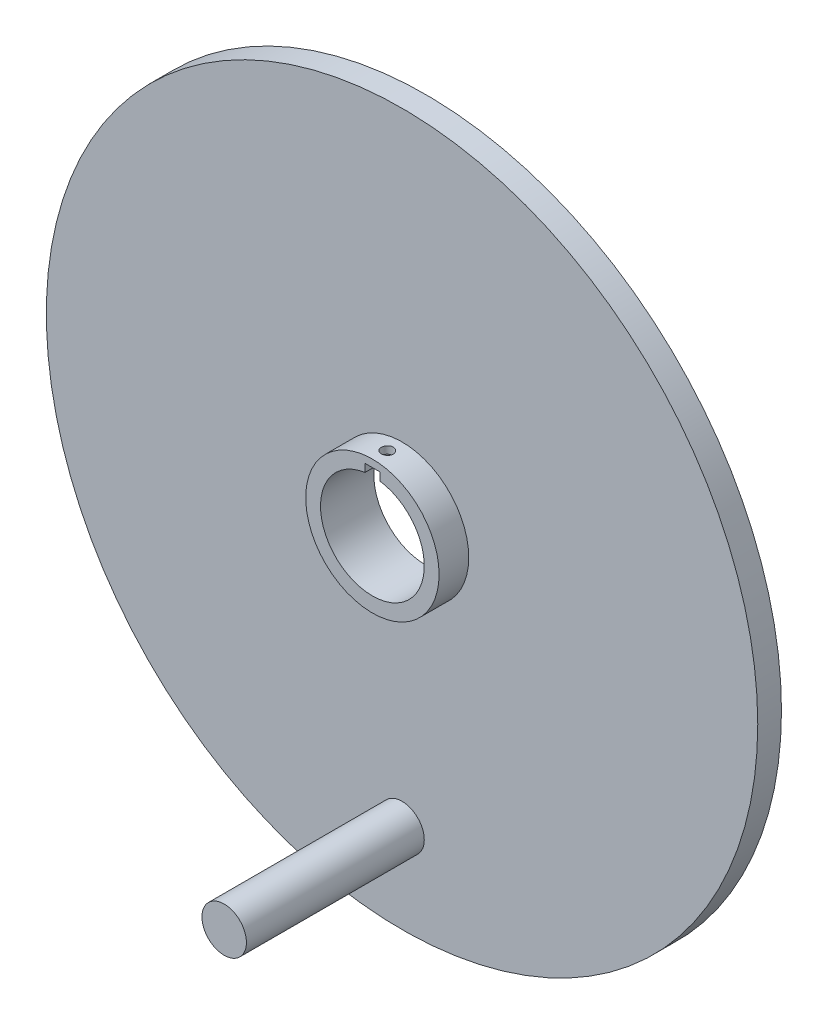
ISO-10303-21;
HEADER;
FILE_DESCRIPTION(('STEP AP214'),'2;1');
FILE_NAME('part.step','',(''),(''),'','','');
FILE_SCHEMA(('AUTOMOTIVE_DESIGN { 1 0 10303 214 1 1 1 1 }'));
ENDSEC;
DATA;
#1=APPLICATION_CONTEXT('core data for automotive mechanical design processes');
#2=APPLICATION_PROTOCOL_DEFINITION('international standard','automotive_design',2000,#1);
#3=PRODUCT_CONTEXT('',#1,'mechanical');
#4=PRODUCT('Part','Part','',(#3));
#5=PRODUCT_RELATED_PRODUCT_CATEGORY('part','',(#4));
#6=PRODUCT_DEFINITION_FORMATION('','',#4);
#7=PRODUCT_DEFINITION_CONTEXT('part definition',#1,'design');
#8=PRODUCT_DEFINITION('design','',#6,#7);
#9=PRODUCT_DEFINITION_SHAPE('','',#8);
#10=(LENGTH_UNIT() NAMED_UNIT(*) SI_UNIT(.MILLI.,.METRE.));
#11=(NAMED_UNIT(*) PLANE_ANGLE_UNIT() SI_UNIT($,.RADIAN.));
#12=(NAMED_UNIT(*) SI_UNIT($,.STERADIAN.) SOLID_ANGLE_UNIT());
#13=UNCERTAINTY_MEASURE_WITH_UNIT(LENGTH_MEASURE(1.E-05),#10,'distance_accuracy_value','');
#14=(GEOMETRIC_REPRESENTATION_CONTEXT(3) GLOBAL_UNCERTAINTY_ASSIGNED_CONTEXT((#13)) GLOBAL_UNIT_ASSIGNED_CONTEXT((#10,
#11,#12)) REPRESENTATION_CONTEXT('',''));
#15=CARTESIAN_POINT('',(0.,0.,0.));
#16=DIRECTION('',(0.,0.,1.));
#17=DIRECTION('',(1.,0.,0.));
#18=AXIS2_PLACEMENT_3D('',#15,#16,#17);
#19=CARTESIAN_POINT('',(0.,0.,18.));
#20=DIRECTION('',(0.,0.,-1.));
#21=DIRECTION('',(-1.,0.,0.));
#22=AXIS2_PLACEMENT_3D('',#19,#20,#21);
#23=CYLINDRICAL_SURFACE('',#22,22.5);
#24=CARTESIAN_POINT('',(0.,0.,18.));
#25=DIRECTION('',(0.,0.,1.));
#26=DIRECTION('',(1.,0.,0.));
#27=AXIS2_PLACEMENT_3D('',#24,#25,#26);
#28=CIRCLE('',#27,22.5);
#29=CARTESIAN_POINT('',(22.5,0.,18.));
#30=VERTEX_POINT('',#29);
#31=EDGE_CURVE('E109',#30,#30,#28,.T.);
#32=ORIENTED_EDGE('',*,*,#31,.F.);
#33=EDGE_LOOP('',(#32));
#34=FACE_BOUND('',#33,.T.);
#35=CARTESIAN_POINT('',(0.,0.,8.));
#36=DIRECTION('',(0.,0.,1.));
#37=DIRECTION('',(1.,0.,0.));
#38=AXIS2_PLACEMENT_3D('',#35,#36,#37);
#39=CIRCLE('',#38,22.5);
#40=CARTESIAN_POINT('',(22.5,0.,8.));
#41=VERTEX_POINT('',#40);
#42=EDGE_CURVE('E108',#41,#41,#39,.T.);
#43=ORIENTED_EDGE('',*,*,#42,.T.);
#44=EDGE_LOOP('',(#43));
#45=FACE_BOUND('',#44,.T.);
#46=CARTESIAN_POINT('',(0.,22.5,11.));
#47=CARTESIAN_POINT('',(-0.112103513817553,22.499998841049,11.0000048838877));
#48=CARTESIAN_POINT('',(-0.224282655152045,22.4991532643947,11.0094571119053));
#49=CARTESIAN_POINT('',(-0.445535202780816,22.4958613940795,11.0470236371428));
#50=CARTESIAN_POINT('',(-0.554604977181987,22.4934133026036,11.0751588948258));
#51=CARTESIAN_POINT('',(-0.766402486160084,22.4871929547959,11.1492697190377));
#52=CARTESIAN_POINT('',(-0.869133845484064,22.4834214636859,11.1952349774461));
#53=CARTESIAN_POINT('',(-1.06539921818257,22.4749768821186,11.3036820722199));
#54=CARTESIAN_POINT('',(-1.15893514981746,22.47030398031,11.3661604537051));
#55=CARTESIAN_POINT('',(-1.33444762738098,22.4605656133862,11.5060540030495));
#56=CARTESIAN_POINT('',(-1.41639403453921,22.4554991759624,11.5835069191725));
#57=CARTESIAN_POINT('',(-1.56614255656144,22.4455528773909,11.7510708848522));
#58=CARTESIAN_POINT('',(-1.63394404001184,22.4406730245801,11.8411824991788));
#59=CARTESIAN_POINT('',(-1.75358177510593,22.4316421475586,12.031690592255));
#60=CARTESIAN_POINT('',(-1.80539126224074,22.4274923501196,12.1321039420635));
#61=CARTESIAN_POINT('',(-1.89140338443427,22.4204029110342,12.3402477540592));
#62=CARTESIAN_POINT('',(-1.92560636914368,22.4174632453557,12.4479780708894));
#63=CARTESIAN_POINT('',(-1.97534648409909,22.4131353097158,12.6673938000392));
#64=CARTESIAN_POINT('',(-1.9909330386816,22.4117429325812,12.7790679258317));
#65=CARTESIAN_POINT('',(-2.00315056442579,22.4106543281064,13.003455244577));
#66=CARTESIAN_POINT('',(-1.9997819358826,22.4109580649477,13.1161684155371));
#67=CARTESIAN_POINT('',(-1.97422552957043,22.413223630757,13.3390949859568));
#68=CARTESIAN_POINT('',(-1.95209154398904,22.4151807202191,13.4493146070888));
#69=CARTESIAN_POINT('',(-1.88971633801144,22.4205250533742,13.6644682253377));
#70=CARTESIAN_POINT('',(-1.84947491944523,22.4239123127191,13.7694021645936));
#71=CARTESIAN_POINT('',(-1.75196719256288,22.4317407834582,13.9711766873128));
#72=CARTESIAN_POINT('',(-1.6946768342642,22.4361834819036,14.0680055885631));
#73=CARTESIAN_POINT('',(-1.56471480998869,22.4456209172064,14.2506936393237));
#74=CARTESIAN_POINT('',(-1.49204278900312,22.450615666804,14.3365525355731));
#75=CARTESIAN_POINT('',(-1.33307902145923,22.4606155201411,14.4951760717322));
#76=CARTESIAN_POINT('',(-1.24674078579769,22.4656205994758,14.567894132508));
#77=CARTESIAN_POINT('',(-1.06305736369639,22.4750606649908,14.6978113821694));
#78=CARTESIAN_POINT('',(-0.965712168498791,22.4794956507175,14.755010558707));
#79=CARTESIAN_POINT('',(-0.762747198146112,22.4872968545856,14.8522637887687));
#80=CARTESIAN_POINT('',(-0.657126383933074,22.4906629382503,14.8923156852459));
#81=CARTESIAN_POINT('',(-0.440622671897876,22.4959455915378,14.9541043399795));
#82=CARTESIAN_POINT('',(-0.329739898412671,22.4978621953927,14.9758415307741));
#83=CARTESIAN_POINT('',(-0.106263448462925,22.5000255466339,15.0003251189865));
#84=CARTESIAN_POINT('',(0.00632312900749421,22.5002779494562,15.0031358347306));
#85=CARTESIAN_POINT('',(0.230365844637086,22.4990995832364,14.9898553159933));
#86=CARTESIAN_POINT('',(0.341821994804208,22.4976688320926,14.9737642825081));
#87=CARTESIAN_POINT('',(0.560255927280843,22.4932886530511,14.9231903559356));
#88=CARTESIAN_POINT('',(0.667240687757264,22.4903416949801,14.8887373703027));
#89=CARTESIAN_POINT('',(0.873911328849083,22.48326001163,14.8024481386809));
#90=CARTESIAN_POINT('',(0.973597078729127,22.4791252650825,14.7506115814211));
#91=CARTESIAN_POINT('',(1.16313209411638,22.4701170931205,14.6308656891189));
#92=CARTESIAN_POINT('',(1.25295441515761,22.4652417269551,14.5629138543877));
#93=CARTESIAN_POINT('',(1.41994062176185,22.4553062675826,14.4129275596715));
#94=CARTESIAN_POINT('',(1.49710425692056,22.4502461707237,14.3308928211751));
#95=CARTESIAN_POINT('',(1.63680416955372,22.4404947242168,14.1547897959009));
#96=CARTESIAN_POINT('',(1.69929839944319,22.4358044595506,14.0606880849501));
#97=CARTESIAN_POINT('',(1.80759698106831,22.4273394873951,13.8632882117221));
#98=CARTESIAN_POINT('',(1.85340151900228,22.4235647696917,13.75999015206));
#99=CARTESIAN_POINT('',(1.92694925420648,22.4173646141511,13.5472772489183));
#100=CARTESIAN_POINT('',(1.95471796462342,22.414937271053,13.4378712846924));
#101=CARTESIAN_POINT('',(1.9914887720945,22.4117004838982,13.215927148397));
#102=CARTESIAN_POINT('',(2.00049128492813,22.4108910039965,13.1033890457784));
#103=CARTESIAN_POINT('',(1.99946904895077,22.4109821979608,12.8787930507751));
#104=CARTESIAN_POINT('',(1.98951036026824,22.4118769344038,12.7667348494104));
#105=CARTESIAN_POINT('',(1.95098639898583,22.4152631183473,12.5458894961554));
#106=CARTESIAN_POINT('',(1.92242110011842,22.417754568102,12.4371023488832));
#107=CARTESIAN_POINT('',(1.84751200227508,22.4240518674675,12.2258844112851));
#108=CARTESIAN_POINT('',(1.80116963693464,22.4278576110845,12.1234531091643));
#109=CARTESIAN_POINT('',(1.69202906668557,22.4363548843694,11.9278132463832));
#110=CARTESIAN_POINT('',(1.62923106773845,22.4410464029507,11.834604570311));
#111=CARTESIAN_POINT('',(1.48871346789508,22.4508061076651,11.6597174745051));
#112=CARTESIAN_POINT('',(1.41094481754435,22.455875497432,11.578078531764));
#113=CARTESIAN_POINT('',(1.24278571224902,22.4658087348866,11.4289773867176));
#114=CARTESIAN_POINT('',(1.15239221773902,22.4706725327074,11.3615186082648));
#115=CARTESIAN_POINT('',(0.961352108627444,22.479656553239,11.242589020496));
#116=CARTESIAN_POINT('',(0.860684717484236,22.4837752205534,11.1911514963903));
#117=CARTESIAN_POINT('',(0.652172657916491,22.4907871749524,11.1059762928281));
#118=CARTESIAN_POINT('',(0.544336350087787,22.4936818614435,11.0722183892421));
#119=CARTESIAN_POINT('',(0.363226469823293,22.4971815146108,11.0319019955605));
#120=CARTESIAN_POINT('',(0.291115543292061,22.4982335985338,11.0199547865985));
#121=CARTESIAN_POINT('',(0.146013772450278,22.4996432176176,11.0040022104501));
#122=CARTESIAN_POINT('',(0.0730229308628294,22.5000007549273,10.9999968186921));
#123=CARTESIAN_POINT('',(0.,22.5,11.));
#124=B_SPLINE_CURVE_WITH_KNOTS('',3,(#46,#47,#48,#49,#50,#51,#52,#53,#54,#55,#56,#57,#58,#59,
#60,#61,#62,#63,#64,#65,#66,#67,#68,#69,#70,#71,#72,#73,#74,#75,#76,#77,#78,#79,#80,#81,#82,#83,
#84,#85,#86,#87,#88,#89,#90,#91,#92,#93,#94,#95,#96,#97,#98,#99,#100,#101,#102,#103,#104,#105,
#106,#107,#108,#109,#110,#111,#112,#113,#114,#115,#116,#117,#118,#119,#120,#121,#122,#123),
.UNSPECIFIED.,.T.,.F.,(4,2,2,2,2,2,2,2,2,2,2,2,2,2,2,2,2,2,2,2,2,2,2,2,2,2,2,2,2,2,2,2,2,2,2,2,
2,2,4),(0.,0.336043915895959,0.672465477350701,1.00869283142059,1.34484989551893,
1.68186567154393,2.01889648835958,2.35648834568506,2.69407349845462,3.03076039765135,
3.36744018672833,3.70315811056492,4.03887970862984,4.37507715351966,4.71128235869214,
5.04865685412811,5.38603161800295,5.72344880957018,6.06085803213697,6.39712004703985,
6.73337848625503,7.06909090308952,7.40480933152664,7.74142316985629,8.07804366601699,
8.41561756166208,8.75318769105355,9.09027925394884,9.42736334824279,9.76327520249732,
10.0991875309702,10.4350727754115,10.7709538160566,11.1079546578805,11.4450367765554,
11.7828146049765,12.1202051928234,12.3391009858617,12.5579961016498),.UNSPECIFIED.);
#125=CARTESIAN_POINT('',(0.,22.5,11.));
#126=VERTEX_POINT('',#125);
#127=EDGE_CURVE('E36',#126,#126,#124,.T.);
#128=ORIENTED_EDGE('',*,*,#127,.F.);
#129=EDGE_LOOP('',(#128));
#130=FACE_BOUND('',#129,.T.);
#131=ADVANCED_FACE('F32',(#34,#45,#130),#23,.T.);
#132=CARTESIAN_POINT('',(0.,0.,8.));
#133=DIRECTION('',(0.,0.,1.));
#134=DIRECTION('',(1.,0.,0.));
#135=AXIS2_PLACEMENT_3D('',#132,#133,#134);
#136=PLANE('',#135);
#137=CARTESIAN_POINT('',(0.,-90.,8.));
#138=DIRECTION('',(0.,0.,1.));
#139=DIRECTION('',(1.,0.,0.));
#140=AXIS2_PLACEMENT_3D('',#137,#138,#139);
#141=CIRCLE('',#140,7.5);
#142=CARTESIAN_POINT('',(7.50000000000001,-90.,8.));
#143=VERTEX_POINT('',#142);
#144=EDGE_CURVE('E175',#143,#143,#141,.T.);
#145=ORIENTED_EDGE('',*,*,#144,.F.);
#146=EDGE_LOOP('',(#145));
#147=FACE_BOUND('',#146,.T.);
#148=CARTESIAN_POINT('',(0.,0.,8.));
#149=DIRECTION('',(0.,0.,1.));
#150=DIRECTION('',(1.,0.,0.));
#151=AXIS2_PLACEMENT_3D('',#148,#149,#150);
#152=CIRCLE('',#151,120.);
#153=CARTESIAN_POINT('',(120.,0.,8.));
#154=VERTEX_POINT('',#153);
#155=EDGE_CURVE('E11',#154,#154,#152,.T.);
#156=ORIENTED_EDGE('',*,*,#155,.T.);
#157=EDGE_LOOP('',(#156));
#158=FACE_BOUND('',#157,.T.);
#159=ORIENTED_EDGE('',*,*,#42,.F.);
#160=EDGE_LOOP('',(#159));
#161=FACE_BOUND('',#160,.T.);
#162=ADVANCED_FACE('F131',(#147,#158,#161),#136,.T.);
#163=CARTESIAN_POINT('',(0.,0.,0.));
#164=DIRECTION('',(0.,0.,1.));
#165=DIRECTION('',(1.,0.,0.));
#166=AXIS2_PLACEMENT_3D('',#163,#164,#165);
#167=PLANE('',#166);
#168=CARTESIAN_POINT('',(0.,0.,0.));
#169=DIRECTION('',(0.,0.,1.));
#170=DIRECTION('',(1.,0.,0.));
#171=AXIS2_PLACEMENT_3D('',#168,#169,#170);
#172=CIRCLE('',#171,120.);
#173=CARTESIAN_POINT('',(120.,0.,0.));
#174=VERTEX_POINT('',#173);
#175=EDGE_CURVE('E46',#174,#174,#172,.T.);
#176=ORIENTED_EDGE('',*,*,#175,.F.);
#177=EDGE_LOOP('',(#176));
#178=FACE_BOUND('',#177,.T.);
#179=CARTESIAN_POINT('',(0.,0.,0.));
#180=DIRECTION('',(0.,0.,1.));
#181=DIRECTION('',(1.,0.,0.));
#182=AXIS2_PLACEMENT_3D('',#179,#180,#181);
#183=CIRCLE('',#182,17.5);
#184=CARTESIAN_POINT('',(-2.5,17.3205080756888,0.));
#185=VERTEX_POINT('',#184);
#186=CARTESIAN_POINT('',(2.5,17.3205080756888,0.));
#187=VERTEX_POINT('',#186);
#188=EDGE_CURVE('E54',#185,#187,#183,.T.);
#189=ORIENTED_EDGE('',*,*,#188,.T.);
#190=DIRECTION('',(0.,1.,0.));
#191=VECTOR('',#190,1.);
#192=CARTESIAN_POINT('',(2.5,20.,0.));
#193=LINE('',#192,#191);
#194=CARTESIAN_POINT('',(2.5,20.,0.));
#195=VERTEX_POINT('',#194);
#196=EDGE_CURVE('E88',#187,#195,#193,.T.);
#197=ORIENTED_EDGE('',*,*,#196,.T.);
#198=DIRECTION('',(-1.,0.,0.));
#199=VECTOR('',#198,1.);
#200=CARTESIAN_POINT('',(-2.5,20.,0.));
#201=LINE('',#200,#199);
#202=CARTESIAN_POINT('',(-2.5,20.,0.));
#203=VERTEX_POINT('',#202);
#204=EDGE_CURVE('E116',#195,#203,#201,.T.);
#205=ORIENTED_EDGE('',*,*,#204,.T.);
#206=DIRECTION('',(0.,-1.,0.));
#207=VECTOR('',#206,1.);
#208=CARTESIAN_POINT('',(-2.5,20.,0.));
#209=LINE('',#208,#207);
#210=EDGE_CURVE('E119',#203,#185,#209,.T.);
#211=ORIENTED_EDGE('',*,*,#210,.T.);
#212=EDGE_LOOP('',(#189,#197,#205,#211));
#213=FACE_BOUND('',#212,.T.);
#214=ADVANCED_FACE('F128',(#178,#213),#167,.F.);
#215=CARTESIAN_POINT('',(0.,0.,8.));
#216=DIRECTION('',(0.,0.,-1.));
#217=DIRECTION('',(-1.,0.,0.));
#218=AXIS2_PLACEMENT_3D('',#215,#216,#217);
#219=CYLINDRICAL_SURFACE('',#218,120.);
#220=ORIENTED_EDGE('',*,*,#155,.F.);
#221=EDGE_LOOP('',(#220));
#222=FACE_BOUND('',#221,.T.);
#223=ORIENTED_EDGE('',*,*,#175,.T.);
#224=EDGE_LOOP('',(#223));
#225=FACE_BOUND('',#224,.T.);
#226=ADVANCED_FACE('F34',(#222,#225),#219,.T.);
#227=CARTESIAN_POINT('',(0.,0.,8.));
#228=DIRECTION('',(0.,0.,-1.));
#229=DIRECTION('',(-1.,0.,0.));
#230=AXIS2_PLACEMENT_3D('',#227,#228,#229);
#231=CYLINDRICAL_SURFACE('',#230,17.5);
#232=ORIENTED_EDGE('',*,*,#188,.F.);
#233=DIRECTION('',(0.,0.,-1.));
#234=VECTOR('',#233,1.);
#235=CARTESIAN_POINT('',(-2.5,17.3205080756888,8.));
#236=LINE('',#235,#234);
#237=CARTESIAN_POINT('',(-2.5,17.3205080756888,18.));
#238=VERTEX_POINT('',#237);
#239=EDGE_CURVE('E94',#238,#185,#236,.T.);
#240=ORIENTED_EDGE('',*,*,#239,.F.);
#241=CARTESIAN_POINT('',(0.,0.,18.));
#242=DIRECTION('',(0.,0.,1.));
#243=DIRECTION('',(1.,0.,0.));
#244=AXIS2_PLACEMENT_3D('',#241,#242,#243);
#245=CIRCLE('',#244,17.5);
#246=CARTESIAN_POINT('',(2.5,17.3205080756888,18.));
#247=VERTEX_POINT('',#246);
#248=EDGE_CURVE('E92',#238,#247,#245,.T.);
#249=ORIENTED_EDGE('',*,*,#248,.T.);
#250=DIRECTION('',(0.,0.,-1.));
#251=VECTOR('',#250,1.);
#252=CARTESIAN_POINT('',(2.5,17.3205080756888,8.));
#253=LINE('',#252,#251);
#254=EDGE_CURVE('E81',#247,#187,#253,.T.);
#255=ORIENTED_EDGE('',*,*,#254,.T.);
#256=EDGE_LOOP('',(#232,#240,#249,#255));
#257=FACE_BOUND('',#256,.T.);
#258=ADVANCED_FACE('F93',(#257),#231,.F.);
#259=CARTESIAN_POINT('',(2.5,20.,8.));
#260=DIRECTION('',(-1.,0.,0.));
#261=DIRECTION('',(0.,0.,1.));
#262=AXIS2_PLACEMENT_3D('',#259,#260,#261);
#263=PLANE('',#262);
#264=ORIENTED_EDGE('',*,*,#196,.F.);
#265=ORIENTED_EDGE('',*,*,#254,.F.);
#266=DIRECTION('',(0.,1.,0.));
#267=VECTOR('',#266,1.);
#268=CARTESIAN_POINT('',(2.5,20.,18.));
#269=LINE('',#268,#267);
#270=CARTESIAN_POINT('',(2.5,20.,18.));
#271=VERTEX_POINT('',#270);
#272=EDGE_CURVE('E85',#247,#271,#269,.T.);
#273=ORIENTED_EDGE('',*,*,#272,.T.);
#274=DIRECTION('',(0.,0.,-1.));
#275=VECTOR('',#274,1.);
#276=CARTESIAN_POINT('',(2.5,20.,8.));
#277=LINE('',#276,#275);
#278=EDGE_CURVE('E89',#271,#195,#277,.T.);
#279=ORIENTED_EDGE('',*,*,#278,.T.);
#280=EDGE_LOOP('',(#264,#265,#273,#279));
#281=FACE_BOUND('',#280,.T.);
#282=ADVANCED_FACE('F83',(#281),#263,.T.);
#283=CARTESIAN_POINT('',(-2.5,20.,8.));
#284=DIRECTION('',(0.,-1.,0.));
#285=DIRECTION('',(0.,0.,-1.));
#286=AXIS2_PLACEMENT_3D('',#283,#284,#285);
#287=PLANE('',#286);
#288=CARTESIAN_POINT('',(0.,20.,13.));
#289=DIRECTION('',(0.,-1.,0.));
#290=DIRECTION('',(0.,0.,-1.));
#291=AXIS2_PLACEMENT_3D('',#288,#289,#290);
#292=CIRCLE('',#291,2.);
#293=CARTESIAN_POINT('',(0.,20.,11.));
#294=VERTEX_POINT('',#293);
#295=EDGE_CURVE('E98',#294,#294,#292,.F.);
#296=ORIENTED_EDGE('',*,*,#295,.T.);
#297=EDGE_LOOP('',(#296));
#298=FACE_BOUND('',#297,.T.);
#299=ORIENTED_EDGE('',*,*,#204,.F.);
#300=ORIENTED_EDGE('',*,*,#278,.F.);
#301=DIRECTION('',(-1.,0.,0.));
#302=VECTOR('',#301,1.);
#303=CARTESIAN_POINT('',(-2.5,20.,18.));
#304=LINE('',#303,#302);
#305=CARTESIAN_POINT('',(-2.5,20.,18.));
#306=VERTEX_POINT('',#305);
#307=EDGE_CURVE('E101',#271,#306,#304,.T.);
#308=ORIENTED_EDGE('',*,*,#307,.T.);
#309=DIRECTION('',(0.,0.,-1.));
#310=VECTOR('',#309,1.);
#311=CARTESIAN_POINT('',(-2.5,20.,8.));
#312=LINE('',#311,#310);
#313=EDGE_CURVE('E62',#306,#203,#312,.T.);
#314=ORIENTED_EDGE('',*,*,#313,.T.);
#315=EDGE_LOOP('',(#299,#300,#308,#314));
#316=FACE_BOUND('',#315,.T.);
#317=ADVANCED_FACE('F134',(#298,#316),#287,.T.);
#318=CARTESIAN_POINT('',(-2.5,20.,8.));
#319=DIRECTION('',(1.,0.,0.));
#320=DIRECTION('',(0.,1.,0.));
#321=AXIS2_PLACEMENT_3D('',#318,#319,#320);
#322=PLANE('',#321);
#323=ORIENTED_EDGE('',*,*,#210,.F.);
#324=ORIENTED_EDGE('',*,*,#313,.F.);
#325=DIRECTION('',(0.,-1.,0.));
#326=VECTOR('',#325,1.);
#327=CARTESIAN_POINT('',(-2.5,17.3205080756888,18.));
#328=LINE('',#327,#326);
#329=EDGE_CURVE('E103',#306,#238,#328,.T.);
#330=ORIENTED_EDGE('',*,*,#329,.T.);
#331=ORIENTED_EDGE('',*,*,#239,.T.);
#332=EDGE_LOOP('',(#323,#324,#330,#331));
#333=FACE_BOUND('',#332,.T.);
#334=ADVANCED_FACE('F133',(#333),#322,.T.);
#335=CARTESIAN_POINT('',(0.,0.,18.));
#336=DIRECTION('',(0.,0.,1.));
#337=DIRECTION('',(1.,0.,0.));
#338=AXIS2_PLACEMENT_3D('',#335,#336,#337);
#339=PLANE('',#338);
#340=ORIENTED_EDGE('',*,*,#31,.T.);
#341=EDGE_LOOP('',(#340));
#342=FACE_BOUND('',#341,.T.);
#343=ORIENTED_EDGE('',*,*,#272,.F.);
#344=ORIENTED_EDGE('',*,*,#248,.F.);
#345=ORIENTED_EDGE('',*,*,#329,.F.);
#346=ORIENTED_EDGE('',*,*,#307,.F.);
#347=EDGE_LOOP('',(#343,#344,#345,#346));
#348=FACE_BOUND('',#347,.T.);
#349=ADVANCED_FACE('F100',(#342,#348),#339,.T.);
#350=CARTESIAN_POINT('',(0.,25.,13.));
#351=DIRECTION('',(0.,-1.,0.));
#352=DIRECTION('',(0.,0.,-1.));
#353=AXIS2_PLACEMENT_3D('',#350,#351,#352);
#354=CYLINDRICAL_SURFACE('',#353,2.);
#355=ORIENTED_EDGE('',*,*,#295,.F.);
#356=EDGE_LOOP('',(#355));
#357=FACE_BOUND('',#356,.T.);
#358=ORIENTED_EDGE('',*,*,#127,.T.);
#359=EDGE_LOOP('',(#358));
#360=FACE_BOUND('',#359,.T.);
#361=ADVANCED_FACE('F157',(#357,#360),#354,.F.);
#362=CARTESIAN_POINT('',(0.,-90.,68.));
#363=DIRECTION('',(0.,0.,-1.));
#364=DIRECTION('',(-1.,0.,0.));
#365=AXIS2_PLACEMENT_3D('',#362,#363,#364);
#366=CYLINDRICAL_SURFACE('',#365,7.5);
#367=CARTESIAN_POINT('',(0.,-90.,68.));
#368=DIRECTION('',(0.,0.,1.));
#369=DIRECTION('',(1.,0.,0.));
#370=AXIS2_PLACEMENT_3D('',#367,#368,#369);
#371=CIRCLE('',#370,7.5);
#372=CARTESIAN_POINT('',(7.50000000000001,-90.,68.));
#373=VERTEX_POINT('',#372);
#374=EDGE_CURVE('E174',#373,#373,#371,.T.);
#375=ORIENTED_EDGE('',*,*,#374,.F.);
#376=EDGE_LOOP('',(#375));
#377=FACE_BOUND('',#376,.T.);
#378=ORIENTED_EDGE('',*,*,#144,.T.);
#379=EDGE_LOOP('',(#378));
#380=FACE_BOUND('',#379,.T.);
#381=ADVANCED_FACE('F162',(#377,#380),#366,.T.);
#382=CARTESIAN_POINT('',(0.,-90.,68.));
#383=DIRECTION('',(0.,0.,1.));
#384=DIRECTION('',(1.,0.,0.));
#385=AXIS2_PLACEMENT_3D('',#382,#383,#384);
#386=PLANE('',#385);
#387=ORIENTED_EDGE('',*,*,#374,.T.);
#388=EDGE_LOOP('',(#387));
#389=FACE_BOUND('',#388,.T.);
#390=ADVANCED_FACE('F166',(#389),#386,.T.);
#391=CLOSED_SHELL('',(#131,#162,#214,#226,#258,#282,#317,#334,#349,#361,#381,#390));
#392=MANIFOLD_SOLID_BREP('B2',#391);
#393=ADVANCED_BREP_SHAPE_REPRESENTATION('',(#18,#392),#14);
#394=SHAPE_DEFINITION_REPRESENTATION(#9,#393);
ENDSEC;
END-ISO-10303-21;
